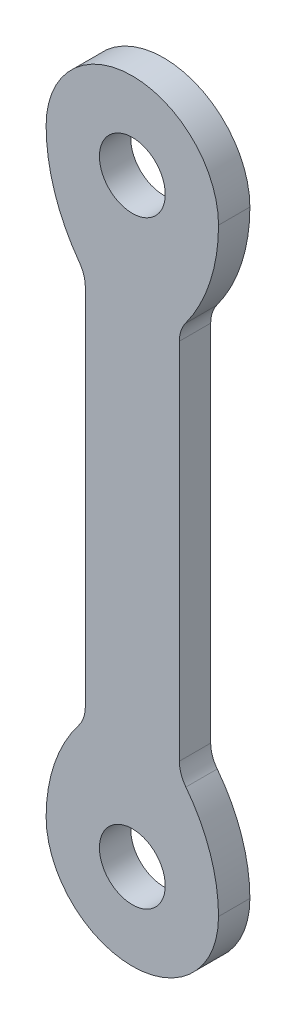
ISO-10303-21;
HEADER;
FILE_DESCRIPTION(('STEP AP214'),'2;1');
FILE_NAME('part.step','',(''),(''),'','','');
FILE_SCHEMA(('AUTOMOTIVE_DESIGN { 1 0 10303 214 1 1 1 1 }'));
ENDSEC;
DATA;
#1=APPLICATION_CONTEXT('core data for automotive mechanical design processes');
#2=APPLICATION_PROTOCOL_DEFINITION('international standard','automotive_design',2000,#1);
#3=PRODUCT_CONTEXT('',#1,'mechanical');
#4=PRODUCT('Part','Part','',(#3));
#5=PRODUCT_RELATED_PRODUCT_CATEGORY('part','',(#4));
#6=PRODUCT_DEFINITION_FORMATION('','',#4);
#7=PRODUCT_DEFINITION_CONTEXT('part definition',#1,'design');
#8=PRODUCT_DEFINITION('design','',#6,#7);
#9=PRODUCT_DEFINITION_SHAPE('','',#8);
#10=(LENGTH_UNIT() NAMED_UNIT(*) SI_UNIT(.MILLI.,.METRE.));
#11=(NAMED_UNIT(*) PLANE_ANGLE_UNIT() SI_UNIT($,.RADIAN.));
#12=(NAMED_UNIT(*) SI_UNIT($,.STERADIAN.) SOLID_ANGLE_UNIT());
#13=UNCERTAINTY_MEASURE_WITH_UNIT(LENGTH_MEASURE(1.E-05),#10,'distance_accuracy_value','');
#14=(GEOMETRIC_REPRESENTATION_CONTEXT(3) GLOBAL_UNCERTAINTY_ASSIGNED_CONTEXT((#13)) GLOBAL_UNIT_ASSIGNED_CONTEXT((#10,
#11,#12)) REPRESENTATION_CONTEXT('',''));
#15=CARTESIAN_POINT('',(0.,0.,0.));
#16=DIRECTION('',(0.,0.,1.));
#17=DIRECTION('',(1.,0.,0.));
#18=AXIS2_PLACEMENT_3D('',#15,#16,#17);
#19=CARTESIAN_POINT('',(0.,0.,-10.));
#20=DIRECTION('',(0.,0.,1.));
#21=DIRECTION('',(-1.,0.,0.));
#22=AXIS2_PLACEMENT_3D('',#19,#20,#21);
#23=CYLINDRICAL_SURFACE('',#22,27.5);
#24=CARTESIAN_POINT('',(0.,0.,0.));
#25=DIRECTION('',(0.,0.,1.));
#26=DIRECTION('',(1.,0.,0.));
#27=AXIS2_PLACEMENT_3D('',#24,#25,#26);
#28=CIRCLE('',#27,27.5);
#29=CARTESIAN_POINT('',(-27.5,-1.77635683940025E-13,0.));
#30=VERTEX_POINT('',#29);
#31=CARTESIAN_POINT('',(27.5,0.,0.));
#32=VERTEX_POINT('',#31);
#33=EDGE_CURVE('E160',#30,#32,#28,.T.);
#34=ORIENTED_EDGE('',*,*,#33,.F.);
#35=DIRECTION('',(0.,0.,1.));
#36=VECTOR('',#35,1.);
#37=CARTESIAN_POINT('',(-27.5,-1.77635683940025E-13,-10.));
#38=LINE('',#37,#36);
#39=CARTESIAN_POINT('',(-27.5,-1.77635683940025E-13,-10.));
#40=VERTEX_POINT('',#39);
#41=EDGE_CURVE('E159',#40,#30,#38,.T.);
#42=ORIENTED_EDGE('',*,*,#41,.F.);
#43=CARTESIAN_POINT('',(0.,0.,-10.));
#44=DIRECTION('',(0.,0.,1.));
#45=DIRECTION('',(1.,0.,0.));
#46=AXIS2_PLACEMENT_3D('',#43,#44,#45);
#47=CIRCLE('',#46,27.5);
#48=CARTESIAN_POINT('',(27.5,0.,-10.));
#49=VERTEX_POINT('',#48);
#50=EDGE_CURVE('E191',#40,#49,#47,.T.);
#51=ORIENTED_EDGE('',*,*,#50,.T.);
#52=DIRECTION('',(0.,0.,1.));
#53=VECTOR('',#52,1.);
#54=CARTESIAN_POINT('',(27.5,0.,-10.));
#55=LINE('',#54,#53);
#56=EDGE_CURVE('E11',#49,#32,#55,.T.);
#57=ORIENTED_EDGE('',*,*,#56,.T.);
#58=EDGE_LOOP('',(#34,#42,#51,#57));
#59=FACE_BOUND('',#58,.T.);
#60=ADVANCED_FACE('F40',(#59),#23,.T.);
#61=CARTESIAN_POINT('',(-22.5,0.,-10.));
#62=DIRECTION('',(0.,0.,1.));
#63=DIRECTION('',(-1.,0.,0.));
#64=AXIS2_PLACEMENT_3D('',#61,#62,#63);
#65=CYLINDRICAL_SURFACE('',#64,50.);
#66=CARTESIAN_POINT('',(-22.5,0.,0.));
#67=DIRECTION('',(0.,0.,1.));
#68=DIRECTION('',(1.,0.,0.));
#69=AXIS2_PLACEMENT_3D('',#66,#67,#68);
#70=CIRCLE('',#69,50.);
#71=CARTESIAN_POINT('',(17.0833333333333,30.547663122115,0.));
#72=VERTEX_POINT('',#71);
#73=EDGE_CURVE('E162',#32,#72,#70,.T.);
#74=ORIENTED_EDGE('',*,*,#73,.F.);
#75=ORIENTED_EDGE('',*,*,#56,.F.);
#76=CARTESIAN_POINT('',(-22.5,0.,-10.));
#77=DIRECTION('',(0.,0.,1.));
#78=DIRECTION('',(1.,0.,0.));
#79=AXIS2_PLACEMENT_3D('',#76,#77,#78);
#80=CIRCLE('',#79,50.);
#81=CARTESIAN_POINT('',(17.0833333333333,30.547663122115,-10.));
#82=VERTEX_POINT('',#81);
#83=EDGE_CURVE('E106',#49,#82,#80,.T.);
#84=ORIENTED_EDGE('',*,*,#83,.T.);
#85=DIRECTION('',(0.,0.,1.));
#86=VECTOR('',#85,1.);
#87=CARTESIAN_POINT('',(17.0833333333333,30.547663122115,-10.));
#88=LINE('',#87,#86);
#89=EDGE_CURVE('E48',#82,#72,#88,.T.);
#90=ORIENTED_EDGE('',*,*,#89,.T.);
#91=EDGE_LOOP('',(#74,#75,#84,#90));
#92=FACE_BOUND('',#91,.T.);
#93=ADVANCED_FACE('F215',(#92),#65,.T.);
#94=CARTESIAN_POINT('',(25.,36.6571957465379,-10.));
#95=DIRECTION('',(0.,0.,1.));
#96=DIRECTION('',(-1.,0.,0.));
#97=AXIS2_PLACEMENT_3D('',#94,#95,#96);
#98=CYLINDRICAL_SURFACE('',#97,10.);
#99=CARTESIAN_POINT('',(25.,36.6571957465379,0.));
#100=DIRECTION('',(0.,0.,-1.));
#101=DIRECTION('',(-1.,0.,0.));
#102=AXIS2_PLACEMENT_3D('',#99,#100,#101);
#103=CIRCLE('',#102,10.);
#104=CARTESIAN_POINT('',(15.,36.6571957465379,0.));
#105=VERTEX_POINT('',#104);
#106=EDGE_CURVE('E166',#72,#105,#103,.T.);
#107=ORIENTED_EDGE('',*,*,#106,.F.);
#108=ORIENTED_EDGE('',*,*,#89,.F.);
#109=CARTESIAN_POINT('',(25.,36.6571957465379,-10.));
#110=DIRECTION('',(0.,0.,-1.));
#111=DIRECTION('',(-1.,0.,0.));
#112=AXIS2_PLACEMENT_3D('',#109,#110,#111);
#113=CIRCLE('',#112,10.);
#114=CARTESIAN_POINT('',(15.,36.6571957465379,-10.));
#115=VERTEX_POINT('',#114);
#116=EDGE_CURVE('E224',#82,#115,#113,.T.);
#117=ORIENTED_EDGE('',*,*,#116,.T.);
#118=DIRECTION('',(0.,0.,1.));
#119=VECTOR('',#118,1.);
#120=CARTESIAN_POINT('',(15.,36.6571957465379,-10.));
#121=LINE('',#120,#119);
#122=EDGE_CURVE('E210',#115,#105,#121,.T.);
#123=ORIENTED_EDGE('',*,*,#122,.T.);
#124=EDGE_LOOP('',(#107,#108,#117,#123));
#125=FACE_BOUND('',#124,.T.);
#126=ADVANCED_FACE('F261',(#125),#98,.F.);
#127=CARTESIAN_POINT('',(15.,36.6571957465379,-10.));
#128=DIRECTION('',(-1.,0.,0.));
#129=DIRECTION('',(0.,0.,-1.));
#130=AXIS2_PLACEMENT_3D('',#127,#128,#129);
#131=PLANE('',#130);
#132=DIRECTION('',(0.,1.,0.));
#133=VECTOR('',#132,1.);
#134=CARTESIAN_POINT('',(15.,36.6571957465379,0.));
#135=LINE('',#134,#133);
#136=CARTESIAN_POINT('',(15.,152.67572570811,0.));
#137=VERTEX_POINT('',#136);
#138=EDGE_CURVE('E169',#105,#137,#135,.T.);
#139=ORIENTED_EDGE('',*,*,#138,.F.);
#140=ORIENTED_EDGE('',*,*,#122,.F.);
#141=DIRECTION('',(0.,1.,0.));
#142=VECTOR('',#141,1.);
#143=CARTESIAN_POINT('',(15.,36.6571957465379,-10.));
#144=LINE('',#143,#142);
#145=CARTESIAN_POINT('',(15.,152.67572570811,-10.));
#146=VERTEX_POINT('',#145);
#147=EDGE_CURVE('E231',#115,#146,#144,.T.);
#148=ORIENTED_EDGE('',*,*,#147,.T.);
#149=DIRECTION('',(0.,0.,1.));
#150=VECTOR('',#149,1.);
#151=CARTESIAN_POINT('',(15.,152.67572570811,-10.));
#152=LINE('',#151,#150);
#153=EDGE_CURVE('E207',#146,#137,#152,.T.);
#154=ORIENTED_EDGE('',*,*,#153,.T.);
#155=EDGE_LOOP('',(#139,#140,#148,#154));
#156=FACE_BOUND('',#155,.T.);
#157=ADVANCED_FACE('F260',(#156),#131,.F.);
#158=CARTESIAN_POINT('',(25.,152.67572570811,-10.));
#159=DIRECTION('',(0.,0.,1.));
#160=DIRECTION('',(-1.,0.,0.));
#161=AXIS2_PLACEMENT_3D('',#158,#159,#160);
#162=CYLINDRICAL_SURFACE('',#161,10.);
#163=CARTESIAN_POINT('',(25.,152.67572570811,0.));
#164=DIRECTION('',(0.,0.,-1.));
#165=DIRECTION('',(1.,0.,0.));
#166=AXIS2_PLACEMENT_3D('',#163,#164,#165);
#167=CIRCLE('',#166,10.);
#168=CARTESIAN_POINT('',(16.9230769230769,158.571767906863,0.));
#169=VERTEX_POINT('',#168);
#170=EDGE_CURVE('E172',#137,#169,#167,.T.);
#171=ORIENTED_EDGE('',*,*,#170,.F.);
#172=ORIENTED_EDGE('',*,*,#153,.F.);
#173=CARTESIAN_POINT('',(25.,152.67572570811,-10.));
#174=DIRECTION('',(0.,0.,-1.));
#175=DIRECTION('',(1.,0.,0.));
#176=AXIS2_PLACEMENT_3D('',#173,#174,#175);
#177=CIRCLE('',#176,10.);
#178=CARTESIAN_POINT('',(16.9230769230769,158.571767906863,-10.));
#179=VERTEX_POINT('',#178);
#180=EDGE_CURVE('E234',#146,#179,#177,.T.);
#181=ORIENTED_EDGE('',*,*,#180,.T.);
#182=DIRECTION('',(0.,0.,1.));
#183=VECTOR('',#182,1.);
#184=CARTESIAN_POINT('',(16.9230769230769,158.571767906863,-10.));
#185=LINE('',#184,#183);
#186=EDGE_CURVE('E204',#179,#169,#185,.T.);
#187=ORIENTED_EDGE('',*,*,#186,.T.);
#188=EDGE_LOOP('',(#171,#172,#181,#187));
#189=FACE_BOUND('',#188,.T.);
#190=ADVANCED_FACE('F258',(#189),#162,.F.);
#191=CARTESIAN_POINT('',(-27.5,191.,-10.));
#192=DIRECTION('',(0.,0.,1.));
#193=DIRECTION('',(-1.,0.,0.));
#194=AXIS2_PLACEMENT_3D('',#191,#192,#193);
#195=CYLINDRICAL_SURFACE('',#194,55.);
#196=CARTESIAN_POINT('',(-27.5,191.,0.));
#197=DIRECTION('',(0.,0.,1.));
#198=DIRECTION('',(-1.,0.,0.));
#199=AXIS2_PLACEMENT_3D('',#196,#197,#198);
#200=CIRCLE('',#199,55.);
#201=CARTESIAN_POINT('',(27.5,191.,0.));
#202=VERTEX_POINT('',#201);
#203=EDGE_CURVE('E175',#169,#202,#200,.T.);
#204=ORIENTED_EDGE('',*,*,#203,.F.);
#205=ORIENTED_EDGE('',*,*,#186,.F.);
#206=CARTESIAN_POINT('',(-27.5,191.,-10.));
#207=DIRECTION('',(0.,0.,1.));
#208=DIRECTION('',(-1.,0.,0.));
#209=AXIS2_PLACEMENT_3D('',#206,#207,#208);
#210=CIRCLE('',#209,55.);
#211=CARTESIAN_POINT('',(27.5,191.,-10.));
#212=VERTEX_POINT('',#211);
#213=EDGE_CURVE('E237',#179,#212,#210,.T.);
#214=ORIENTED_EDGE('',*,*,#213,.T.);
#215=DIRECTION('',(0.,0.,1.));
#216=VECTOR('',#215,1.);
#217=CARTESIAN_POINT('',(27.5,191.,-10.));
#218=LINE('',#217,#216);
#219=EDGE_CURVE('E201',#212,#202,#218,.T.);
#220=ORIENTED_EDGE('',*,*,#219,.T.);
#221=EDGE_LOOP('',(#204,#205,#214,#220));
#222=FACE_BOUND('',#221,.T.);
#223=ADVANCED_FACE('F254',(#222),#195,.T.);
#224=CARTESIAN_POINT('',(0.,191.,-10.));
#225=DIRECTION('',(0.,0.,1.));
#226=DIRECTION('',(-1.,0.,0.));
#227=AXIS2_PLACEMENT_3D('',#224,#225,#226);
#228=CYLINDRICAL_SURFACE('',#227,27.5);
#229=CARTESIAN_POINT('',(0.,191.,0.));
#230=DIRECTION('',(0.,0.,1.));
#231=DIRECTION('',(1.,0.,0.));
#232=AXIS2_PLACEMENT_3D('',#229,#230,#231);
#233=CIRCLE('',#232,27.5);
#234=CARTESIAN_POINT('',(-27.5,191.,0.));
#235=VERTEX_POINT('',#234);
#236=EDGE_CURVE('E178',#202,#235,#233,.T.);
#237=ORIENTED_EDGE('',*,*,#236,.F.);
#238=ORIENTED_EDGE('',*,*,#219,.F.);
#239=CARTESIAN_POINT('',(0.,191.,-10.));
#240=DIRECTION('',(0.,0.,1.));
#241=DIRECTION('',(1.,0.,0.));
#242=AXIS2_PLACEMENT_3D('',#239,#240,#241);
#243=CIRCLE('',#242,27.5);
#244=CARTESIAN_POINT('',(-27.5,191.,-10.));
#245=VERTEX_POINT('',#244);
#246=EDGE_CURVE('E240',#212,#245,#243,.T.);
#247=ORIENTED_EDGE('',*,*,#246,.T.);
#248=DIRECTION('',(0.,0.,1.));
#249=VECTOR('',#248,1.);
#250=CARTESIAN_POINT('',(-27.5,191.,-10.));
#251=LINE('',#250,#249);
#252=EDGE_CURVE('E198',#245,#235,#251,.T.);
#253=ORIENTED_EDGE('',*,*,#252,.T.);
#254=EDGE_LOOP('',(#237,#238,#247,#253));
#255=FACE_BOUND('',#254,.T.);
#256=ADVANCED_FACE('F251',(#255),#228,.T.);
#257=CARTESIAN_POINT('',(27.5,191.,-10.));
#258=DIRECTION('',(0.,0.,1.));
#259=DIRECTION('',(-1.,0.,0.));
#260=AXIS2_PLACEMENT_3D('',#257,#258,#259);
#261=CYLINDRICAL_SURFACE('',#260,55.);
#262=CARTESIAN_POINT('',(27.5,191.,0.));
#263=DIRECTION('',(0.,0.,1.));
#264=DIRECTION('',(1.,0.,0.));
#265=AXIS2_PLACEMENT_3D('',#262,#263,#264);
#266=CIRCLE('',#265,55.);
#267=CARTESIAN_POINT('',(-16.9230769230769,158.571767906863,0.));
#268=VERTEX_POINT('',#267);
#269=EDGE_CURVE('E181',#235,#268,#266,.T.);
#270=ORIENTED_EDGE('',*,*,#269,.F.);
#271=ORIENTED_EDGE('',*,*,#252,.F.);
#272=CARTESIAN_POINT('',(27.5,191.,-10.));
#273=DIRECTION('',(0.,0.,1.));
#274=DIRECTION('',(1.,0.,0.));
#275=AXIS2_PLACEMENT_3D('',#272,#273,#274);
#276=CIRCLE('',#275,55.);
#277=CARTESIAN_POINT('',(-16.9230769230769,158.571767906863,-10.));
#278=VERTEX_POINT('',#277);
#279=EDGE_CURVE('E154',#245,#278,#276,.T.);
#280=ORIENTED_EDGE('',*,*,#279,.T.);
#281=DIRECTION('',(0.,0.,1.));
#282=VECTOR('',#281,1.);
#283=CARTESIAN_POINT('',(-16.9230769230769,158.571767906863,-10.));
#284=LINE('',#283,#282);
#285=EDGE_CURVE('E195',#278,#268,#284,.T.);
#286=ORIENTED_EDGE('',*,*,#285,.T.);
#287=EDGE_LOOP('',(#270,#271,#280,#286));
#288=FACE_BOUND('',#287,.T.);
#289=ADVANCED_FACE('F245',(#288),#261,.T.);
#290=CARTESIAN_POINT('',(-25.,152.67572570811,-10.));
#291=DIRECTION('',(0.,0.,1.));
#292=DIRECTION('',(-1.,0.,0.));
#293=AXIS2_PLACEMENT_3D('',#290,#291,#292);
#294=CYLINDRICAL_SURFACE('',#293,10.);
#295=CARTESIAN_POINT('',(-25.,152.67572570811,0.));
#296=DIRECTION('',(0.,0.,-1.));
#297=DIRECTION('',(-1.,0.,0.));
#298=AXIS2_PLACEMENT_3D('',#295,#296,#297);
#299=CIRCLE('',#298,10.);
#300=CARTESIAN_POINT('',(-15.,152.67572570811,0.));
#301=VERTEX_POINT('',#300);
#302=EDGE_CURVE('E184',#268,#301,#299,.T.);
#303=ORIENTED_EDGE('',*,*,#302,.F.);
#304=ORIENTED_EDGE('',*,*,#285,.F.);
#305=CARTESIAN_POINT('',(-25.,152.67572570811,-10.));
#306=DIRECTION('',(0.,0.,-1.));
#307=DIRECTION('',(-1.,0.,0.));
#308=AXIS2_PLACEMENT_3D('',#305,#306,#307);
#309=CIRCLE('',#308,10.);
#310=CARTESIAN_POINT('',(-15.,152.67572570811,-10.));
#311=VERTEX_POINT('',#310);
#312=EDGE_CURVE('E152',#278,#311,#309,.T.);
#313=ORIENTED_EDGE('',*,*,#312,.T.);
#314=DIRECTION('',(0.,0.,1.));
#315=VECTOR('',#314,1.);
#316=CARTESIAN_POINT('',(-15.,152.67572570811,-10.));
#317=LINE('',#316,#315);
#318=EDGE_CURVE('E146',#311,#301,#317,.T.);
#319=ORIENTED_EDGE('',*,*,#318,.T.);
#320=EDGE_LOOP('',(#303,#304,#313,#319));
#321=FACE_BOUND('',#320,.T.);
#322=ADVANCED_FACE('F249',(#321),#294,.F.);
#323=CARTESIAN_POINT('',(-15.,152.67572570811,-10.));
#324=DIRECTION('',(1.,0.,0.));
#325=DIRECTION('',(0.,0.,1.));
#326=AXIS2_PLACEMENT_3D('',#323,#324,#325);
#327=PLANE('',#326);
#328=DIRECTION('',(0.,-1.,0.));
#329=VECTOR('',#328,1.);
#330=CARTESIAN_POINT('',(-15.,152.67572570811,0.));
#331=LINE('',#330,#329);
#332=CARTESIAN_POINT('',(-15.,36.6571957465379,0.));
#333=VERTEX_POINT('',#332);
#334=EDGE_CURVE('E187',#301,#333,#331,.T.);
#335=ORIENTED_EDGE('',*,*,#334,.F.);
#336=ORIENTED_EDGE('',*,*,#318,.F.);
#337=DIRECTION('',(0.,-1.,0.));
#338=VECTOR('',#337,1.);
#339=CARTESIAN_POINT('',(-15.,152.67572570811,-10.));
#340=LINE('',#339,#338);
#341=CARTESIAN_POINT('',(-15.,36.6571957465379,-10.));
#342=VERTEX_POINT('',#341);
#343=EDGE_CURVE('E136',#311,#342,#340,.T.);
#344=ORIENTED_EDGE('',*,*,#343,.T.);
#345=DIRECTION('',(0.,0.,1.));
#346=VECTOR('',#345,1.);
#347=CARTESIAN_POINT('',(-15.,36.6571957465379,-10.));
#348=LINE('',#347,#346);
#349=EDGE_CURVE('E141',#342,#333,#348,.T.);
#350=ORIENTED_EDGE('',*,*,#349,.T.);
#351=EDGE_LOOP('',(#335,#336,#344,#350));
#352=FACE_BOUND('',#351,.T.);
#353=ADVANCED_FACE('F149',(#352),#327,.F.);
#354=CARTESIAN_POINT('',(-25.,36.6571957465379,-10.));
#355=DIRECTION('',(0.,0.,1.));
#356=DIRECTION('',(-1.,0.,0.));
#357=AXIS2_PLACEMENT_3D('',#354,#355,#356);
#358=CYLINDRICAL_SURFACE('',#357,10.);
#359=CARTESIAN_POINT('',(-25.,36.6571957465379,0.));
#360=DIRECTION('',(0.,0.,-1.));
#361=DIRECTION('',(1.,0.,0.));
#362=AXIS2_PLACEMENT_3D('',#359,#360,#361);
#363=CIRCLE('',#362,10.);
#364=CARTESIAN_POINT('',(-17.0833333333333,30.547663122115,0.));
#365=VERTEX_POINT('',#364);
#366=EDGE_CURVE('E143',#333,#365,#363,.T.);
#367=ORIENTED_EDGE('',*,*,#366,.F.);
#368=ORIENTED_EDGE('',*,*,#349,.F.);
#369=CARTESIAN_POINT('',(-25.,36.6571957465379,-10.));
#370=DIRECTION('',(0.,0.,-1.));
#371=DIRECTION('',(1.,0.,0.));
#372=AXIS2_PLACEMENT_3D('',#369,#370,#371);
#373=CIRCLE('',#372,10.);
#374=CARTESIAN_POINT('',(-17.0833333333333,30.547663122115,-10.));
#375=VERTEX_POINT('',#374);
#376=EDGE_CURVE('E132',#342,#375,#373,.T.);
#377=ORIENTED_EDGE('',*,*,#376,.T.);
#378=DIRECTION('',(0.,0.,1.));
#379=VECTOR('',#378,1.);
#380=CARTESIAN_POINT('',(-17.0833333333333,30.547663122115,-10.));
#381=LINE('',#380,#379);
#382=EDGE_CURVE('E147',#375,#365,#381,.T.);
#383=ORIENTED_EDGE('',*,*,#382,.T.);
#384=EDGE_LOOP('',(#367,#368,#377,#383));
#385=FACE_BOUND('',#384,.T.);
#386=ADVANCED_FACE('F142',(#385),#358,.F.);
#387=CARTESIAN_POINT('',(22.5,0.,-10.));
#388=DIRECTION('',(0.,0.,1.));
#389=DIRECTION('',(-1.,0.,0.));
#390=AXIS2_PLACEMENT_3D('',#387,#388,#389);
#391=CYLINDRICAL_SURFACE('',#390,50.);
#392=CARTESIAN_POINT('',(22.5,0.,0.));
#393=DIRECTION('',(0.,0.,1.));
#394=DIRECTION('',(-1.,0.,0.));
#395=AXIS2_PLACEMENT_3D('',#392,#393,#394);
#396=CIRCLE('',#395,50.);
#397=EDGE_CURVE('E94',#365,#30,#396,.T.);
#398=ORIENTED_EDGE('',*,*,#397,.F.);
#399=ORIENTED_EDGE('',*,*,#382,.F.);
#400=CARTESIAN_POINT('',(22.5,0.,-10.));
#401=DIRECTION('',(0.,0.,1.));
#402=DIRECTION('',(-1.,0.,0.));
#403=AXIS2_PLACEMENT_3D('',#400,#401,#402);
#404=CIRCLE('',#403,50.);
#405=EDGE_CURVE('E56',#375,#40,#404,.T.);
#406=ORIENTED_EDGE('',*,*,#405,.T.);
#407=ORIENTED_EDGE('',*,*,#41,.T.);
#408=EDGE_LOOP('',(#398,#399,#406,#407));
#409=FACE_BOUND('',#408,.T.);
#410=ADVANCED_FACE('F343',(#409),#391,.T.);
#411=CARTESIAN_POINT('',(0.,0.,-10.));
#412=DIRECTION('',(0.,0.,-1.));
#413=DIRECTION('',(1.,0.,0.));
#414=AXIS2_PLACEMENT_3D('',#411,#412,#413);
#415=PLANE('',#414);
#416=CARTESIAN_POINT('',(0.,191.,-10.));
#417=DIRECTION('',(0.,0.,1.));
#418=DIRECTION('',(1.,0.,0.));
#419=AXIS2_PLACEMENT_3D('',#416,#417,#418);
#420=CIRCLE('',#419,10.5);
#421=CARTESIAN_POINT('',(10.5,191.,-10.));
#422=VERTEX_POINT('',#421);
#423=EDGE_CURVE('E429',#422,#422,#420,.T.);
#424=ORIENTED_EDGE('',*,*,#423,.T.);
#425=EDGE_LOOP('',(#424));
#426=FACE_BOUND('',#425,.T.);
#427=CARTESIAN_POINT('',(0.,0.,-10.));
#428=DIRECTION('',(0.,0.,1.));
#429=DIRECTION('',(1.,0.,0.));
#430=AXIS2_PLACEMENT_3D('',#427,#428,#429);
#431=CIRCLE('',#430,10.5);
#432=CARTESIAN_POINT('',(10.5,0.,-10.));
#433=VERTEX_POINT('',#432);
#434=EDGE_CURVE('E434',#433,#433,#431,.T.);
#435=ORIENTED_EDGE('',*,*,#434,.T.);
#436=EDGE_LOOP('',(#435));
#437=FACE_BOUND('',#436,.T.);
#438=ORIENTED_EDGE('',*,*,#50,.F.);
#439=ORIENTED_EDGE('',*,*,#405,.F.);
#440=ORIENTED_EDGE('',*,*,#376,.F.);
#441=ORIENTED_EDGE('',*,*,#343,.F.);
#442=ORIENTED_EDGE('',*,*,#312,.F.);
#443=ORIENTED_EDGE('',*,*,#279,.F.);
#444=ORIENTED_EDGE('',*,*,#246,.F.);
#445=ORIENTED_EDGE('',*,*,#213,.F.);
#446=ORIENTED_EDGE('',*,*,#180,.F.);
#447=ORIENTED_EDGE('',*,*,#147,.F.);
#448=ORIENTED_EDGE('',*,*,#116,.F.);
#449=ORIENTED_EDGE('',*,*,#83,.F.);
#450=EDGE_LOOP('',(#438,#439,#440,#441,#442,#443,#444,#445,#446,#447,#448,#449));
#451=FACE_BOUND('',#450,.T.);
#452=ADVANCED_FACE('F134',(#426,#437,#451),#415,.T.);
#453=CARTESIAN_POINT('',(0.,0.,0.));
#454=DIRECTION('',(0.,0.,-1.));
#455=DIRECTION('',(1.,0.,0.));
#456=AXIS2_PLACEMENT_3D('',#453,#454,#455);
#457=PLANE('',#456);
#458=CARTESIAN_POINT('',(0.,191.,0.));
#459=DIRECTION('',(0.,0.,1.));
#460=DIRECTION('',(1.,0.,0.));
#461=AXIS2_PLACEMENT_3D('',#458,#459,#460);
#462=CIRCLE('',#461,10.5);
#463=CARTESIAN_POINT('',(10.5,191.,0.));
#464=VERTEX_POINT('',#463);
#465=EDGE_CURVE('E163',#464,#464,#462,.F.);
#466=ORIENTED_EDGE('',*,*,#465,.T.);
#467=EDGE_LOOP('',(#466));
#468=FACE_BOUND('',#467,.T.);
#469=CARTESIAN_POINT('',(0.,0.,0.));
#470=DIRECTION('',(0.,0.,1.));
#471=DIRECTION('',(1.,0.,0.));
#472=AXIS2_PLACEMENT_3D('',#469,#470,#471);
#473=CIRCLE('',#472,10.5);
#474=CARTESIAN_POINT('',(10.5,0.,0.));
#475=VERTEX_POINT('',#474);
#476=EDGE_CURVE('E227',#475,#475,#473,.F.);
#477=ORIENTED_EDGE('',*,*,#476,.T.);
#478=EDGE_LOOP('',(#477));
#479=FACE_BOUND('',#478,.T.);
#480=ORIENTED_EDGE('',*,*,#33,.T.);
#481=ORIENTED_EDGE('',*,*,#73,.T.);
#482=ORIENTED_EDGE('',*,*,#106,.T.);
#483=ORIENTED_EDGE('',*,*,#138,.T.);
#484=ORIENTED_EDGE('',*,*,#170,.T.);
#485=ORIENTED_EDGE('',*,*,#203,.T.);
#486=ORIENTED_EDGE('',*,*,#236,.T.);
#487=ORIENTED_EDGE('',*,*,#269,.T.);
#488=ORIENTED_EDGE('',*,*,#302,.T.);
#489=ORIENTED_EDGE('',*,*,#334,.T.);
#490=ORIENTED_EDGE('',*,*,#366,.T.);
#491=ORIENTED_EDGE('',*,*,#397,.T.);
#492=EDGE_LOOP('',(#480,#481,#482,#483,#484,#485,#486,#487,#488,#489,#490,#491));
#493=FACE_BOUND('',#492,.T.);
#494=ADVANCED_FACE('F218',(#468,#479,#493),#457,.F.);
#495=CARTESIAN_POINT('',(0.,0.,0.000999999999999265));
#496=DIRECTION('',(0.,0.,-1.));
#497=DIRECTION('',(1.,0.,0.));
#498=AXIS2_PLACEMENT_3D('',#495,#496,#497);
#499=CYLINDRICAL_SURFACE('',#498,10.5);
#500=ORIENTED_EDGE('',*,*,#434,.F.);
#501=EDGE_LOOP('',(#500));
#502=FACE_BOUND('',#501,.T.);
#503=ORIENTED_EDGE('',*,*,#476,.F.);
#504=EDGE_LOOP('',(#503));
#505=FACE_BOUND('',#504,.T.);
#506=ADVANCED_FACE('F369',(#502,#505),#499,.F.);
#507=CARTESIAN_POINT('',(0.,191.,0.000999999999999265));
#508=DIRECTION('',(0.,0.,-1.));
#509=DIRECTION('',(1.,0.,0.));
#510=AXIS2_PLACEMENT_3D('',#507,#508,#509);
#511=CYLINDRICAL_SURFACE('',#510,10.5);
#512=ORIENTED_EDGE('',*,*,#423,.F.);
#513=EDGE_LOOP('',(#512));
#514=FACE_BOUND('',#513,.T.);
#515=ORIENTED_EDGE('',*,*,#465,.F.);
#516=EDGE_LOOP('',(#515));
#517=FACE_BOUND('',#516,.T.);
#518=ADVANCED_FACE('F378',(#514,#517),#511,.F.);
#519=CLOSED_SHELL('',(#60,#93,#126,#157,#190,#223,#256,#289,#322,#353,#386,#410,#452,#494,#506,#518));
#520=MANIFOLD_SOLID_BREP('B2',#519);
#521=ADVANCED_BREP_SHAPE_REPRESENTATION('',(#18,#520),#14);
#522=SHAPE_DEFINITION_REPRESENTATION(#9,#521);
ENDSEC;
END-ISO-10303-21;
